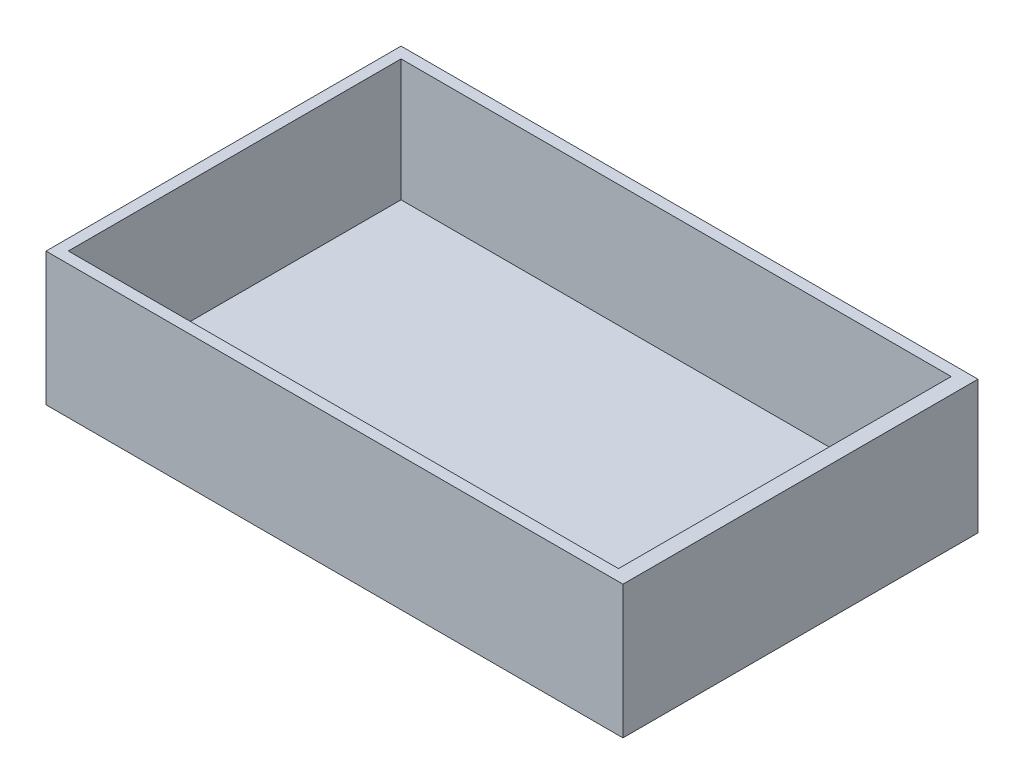
ISO-10303-21;
HEADER;
FILE_DESCRIPTION(('STEP AP214'),'2;1');
FILE_NAME('part.step','',(''),(''),'','','');
FILE_SCHEMA(('AUTOMOTIVE_DESIGN { 1 0 10303 214 1 1 1 1 }'));
ENDSEC;
DATA;
#1=APPLICATION_CONTEXT('core data for automotive mechanical design processes');
#2=APPLICATION_PROTOCOL_DEFINITION('international standard','automotive_design',2000,#1);
#3=PRODUCT_CONTEXT('',#1,'mechanical');
#4=PRODUCT('Part','Part','',(#3));
#5=PRODUCT_RELATED_PRODUCT_CATEGORY('part','',(#4));
#6=PRODUCT_DEFINITION_FORMATION('','',#4);
#7=PRODUCT_DEFINITION_CONTEXT('part definition',#1,'design');
#8=PRODUCT_DEFINITION('design','',#6,#7);
#9=PRODUCT_DEFINITION_SHAPE('','',#8);
#10=(LENGTH_UNIT() NAMED_UNIT(*) SI_UNIT(.MILLI.,.METRE.));
#11=(NAMED_UNIT(*) PLANE_ANGLE_UNIT() SI_UNIT($,.RADIAN.));
#12=(NAMED_UNIT(*) SI_UNIT($,.STERADIAN.) SOLID_ANGLE_UNIT());
#13=UNCERTAINTY_MEASURE_WITH_UNIT(LENGTH_MEASURE(1.E-05),#10,'distance_accuracy_value','');
#14=(GEOMETRIC_REPRESENTATION_CONTEXT(3) GLOBAL_UNCERTAINTY_ASSIGNED_CONTEXT((#13)) GLOBAL_UNIT_ASSIGNED_CONTEXT((#10,
#11,#12)) REPRESENTATION_CONTEXT('',''));
#15=CARTESIAN_POINT('',(0.,0.,0.));
#16=DIRECTION('',(0.,0.,1.));
#17=DIRECTION('',(1.,0.,0.));
#18=AXIS2_PLACEMENT_3D('',#15,#16,#17);
#19=CARTESIAN_POINT('',(0.,10.,0.));
#20=DIRECTION('',(1.,0.,0.));
#21=DIRECTION('',(0.,0.,-1.));
#22=AXIS2_PLACEMENT_3D('',#19,#20,#21);
#23=PLANE('',#22);
#24=DIRECTION('',(0.,0.,1.));
#25=VECTOR('',#24,1.);
#26=CARTESIAN_POINT('',(0.,0.,0.));
#27=LINE('',#26,#25);
#28=CARTESIAN_POINT('',(-1.11022302462516E-13,0.,-320.));
#29=VERTEX_POINT('',#28);
#30=CARTESIAN_POINT('',(0.,0.,0.));
#31=VERTEX_POINT('',#30);
#32=EDGE_CURVE('E149',#29,#31,#27,.T.);
#33=ORIENTED_EDGE('',*,*,#32,.T.);
#34=DIRECTION('',(0.,-1.,0.));
#35=VECTOR('',#34,1.);
#36=CARTESIAN_POINT('',(0.,10.,0.));
#37=LINE('',#36,#35);
#38=CARTESIAN_POINT('',(0.,120.,0.));
#39=VERTEX_POINT('',#38);
#40=EDGE_CURVE('E11',#39,#31,#37,.T.);
#41=ORIENTED_EDGE('',*,*,#40,.F.);
#42=DIRECTION('',(0.,0.,1.));
#43=VECTOR('',#42,1.);
#44=CARTESIAN_POINT('',(0.,120.,0.));
#45=LINE('',#44,#43);
#46=CARTESIAN_POINT('',(-1.11022302462516E-13,120.,-320.));
#47=VERTEX_POINT('',#46);
#48=EDGE_CURVE('E146',#47,#39,#45,.T.);
#49=ORIENTED_EDGE('',*,*,#48,.F.);
#50=DIRECTION('',(0.,-1.,0.));
#51=VECTOR('',#50,1.);
#52=CARTESIAN_POINT('',(-1.11022302462516E-13,10.,-320.));
#53=LINE('',#52,#51);
#54=EDGE_CURVE('E157',#47,#29,#53,.T.);
#55=ORIENTED_EDGE('',*,*,#54,.T.);
#56=EDGE_LOOP('',(#33,#41,#49,#55));
#57=FACE_BOUND('',#56,.T.);
#58=ADVANCED_FACE('F32',(#57),#23,.F.);
#59=CARTESIAN_POINT('',(0.,10.,0.));
#60=DIRECTION('',(0.,0.,-1.));
#61=DIRECTION('',(-1.,0.,0.));
#62=AXIS2_PLACEMENT_3D('',#59,#60,#61);
#63=PLANE('',#62);
#64=DIRECTION('',(1.,0.,0.));
#65=VECTOR('',#64,1.);
#66=CARTESIAN_POINT('',(0.,0.,0.));
#67=LINE('',#66,#65);
#68=CARTESIAN_POINT('',(520.,0.,0.));
#69=VERTEX_POINT('',#68);
#70=EDGE_CURVE('E152',#31,#69,#67,.T.);
#71=ORIENTED_EDGE('',*,*,#70,.T.);
#72=DIRECTION('',(0.,-1.,0.));
#73=VECTOR('',#72,1.);
#74=CARTESIAN_POINT('',(520.,10.,0.));
#75=LINE('',#74,#73);
#76=CARTESIAN_POINT('',(520.,120.,0.));
#77=VERTEX_POINT('',#76);
#78=EDGE_CURVE('E39',#77,#69,#75,.T.);
#79=ORIENTED_EDGE('',*,*,#78,.F.);
#80=DIRECTION('',(1.,0.,0.));
#81=VECTOR('',#80,1.);
#82=CARTESIAN_POINT('',(520.,120.,0.));
#83=LINE('',#82,#81);
#84=EDGE_CURVE('E114',#39,#77,#83,.T.);
#85=ORIENTED_EDGE('',*,*,#84,.F.);
#86=ORIENTED_EDGE('',*,*,#40,.T.);
#87=EDGE_LOOP('',(#71,#79,#85,#86));
#88=FACE_BOUND('',#87,.T.);
#89=ADVANCED_FACE('F175',(#88),#63,.F.);
#90=CARTESIAN_POINT('',(520.,10.,0.));
#91=DIRECTION('',(-1.,0.,0.));
#92=DIRECTION('',(0.,0.,1.));
#93=AXIS2_PLACEMENT_3D('',#90,#91,#92);
#94=PLANE('',#93);
#95=DIRECTION('',(0.,0.,-1.));
#96=VECTOR('',#95,1.);
#97=CARTESIAN_POINT('',(520.,0.,0.));
#98=LINE('',#97,#96);
#99=CARTESIAN_POINT('',(520.,0.,-320.));
#100=VERTEX_POINT('',#99);
#101=EDGE_CURVE('E154',#69,#100,#98,.T.);
#102=ORIENTED_EDGE('',*,*,#101,.T.);
#103=DIRECTION('',(0.,-1.,0.));
#104=VECTOR('',#103,1.);
#105=CARTESIAN_POINT('',(520.,10.,-320.));
#106=LINE('',#105,#104);
#107=CARTESIAN_POINT('',(520.,120.,-320.));
#108=VERTEX_POINT('',#107);
#109=EDGE_CURVE('E159',#108,#100,#106,.T.);
#110=ORIENTED_EDGE('',*,*,#109,.F.);
#111=DIRECTION('',(0.,0.,-1.));
#112=VECTOR('',#111,1.);
#113=CARTESIAN_POINT('',(520.,120.,-320.));
#114=LINE('',#113,#112);
#115=EDGE_CURVE('E140',#77,#108,#114,.T.);
#116=ORIENTED_EDGE('',*,*,#115,.F.);
#117=ORIENTED_EDGE('',*,*,#78,.T.);
#118=EDGE_LOOP('',(#102,#110,#116,#117));
#119=FACE_BOUND('',#118,.T.);
#120=ADVANCED_FACE('F164',(#119),#94,.F.);
#121=CARTESIAN_POINT('',(-1.11022302462516E-13,10.,-320.));
#122=DIRECTION('',(0.,0.,1.));
#123=DIRECTION('',(1.,0.,0.));
#124=AXIS2_PLACEMENT_3D('',#121,#122,#123);
#125=PLANE('',#124);
#126=DIRECTION('',(-1.,0.,0.));
#127=VECTOR('',#126,1.);
#128=CARTESIAN_POINT('',(-1.11022302462516E-13,0.,-320.));
#129=LINE('',#128,#127);
#130=EDGE_CURVE('E54',#100,#29,#129,.T.);
#131=ORIENTED_EDGE('',*,*,#130,.T.);
#132=ORIENTED_EDGE('',*,*,#54,.F.);
#133=DIRECTION('',(-1.,0.,0.));
#134=VECTOR('',#133,1.);
#135=CARTESIAN_POINT('',(-1.11022302462516E-13,120.,-320.));
#136=LINE('',#135,#134);
#137=EDGE_CURVE('E143',#108,#47,#136,.T.);
#138=ORIENTED_EDGE('',*,*,#137,.F.);
#139=ORIENTED_EDGE('',*,*,#109,.T.);
#140=EDGE_LOOP('',(#131,#132,#138,#139));
#141=FACE_BOUND('',#140,.T.);
#142=ADVANCED_FACE('F173',(#141),#125,.F.);
#143=CARTESIAN_POINT('',(0.,0.,0.));
#144=DIRECTION('',(0.,-1.,0.));
#145=DIRECTION('',(0.,0.,-1.));
#146=AXIS2_PLACEMENT_3D('',#143,#144,#145);
#147=PLANE('',#146);
#148=ORIENTED_EDGE('',*,*,#32,.F.);
#149=ORIENTED_EDGE('',*,*,#130,.F.);
#150=ORIENTED_EDGE('',*,*,#101,.F.);
#151=ORIENTED_EDGE('',*,*,#70,.F.);
#152=EDGE_LOOP('',(#148,#149,#150,#151));
#153=FACE_BOUND('',#152,.T.);
#154=ADVANCED_FACE('F169',(#153),#147,.T.);
#155=CARTESIAN_POINT('',(0.,120.,0.));
#156=DIRECTION('',(0.,-1.,0.));
#157=DIRECTION('',(0.,0.,-1.));
#158=AXIS2_PLACEMENT_3D('',#155,#156,#157);
#159=PLANE('',#158);
#160=ORIENTED_EDGE('',*,*,#84,.T.);
#161=ORIENTED_EDGE('',*,*,#115,.T.);
#162=ORIENTED_EDGE('',*,*,#137,.T.);
#163=ORIENTED_EDGE('',*,*,#48,.T.);
#164=EDGE_LOOP('',(#160,#161,#162,#163));
#165=FACE_BOUND('',#164,.T.);
#166=DIRECTION('',(0.,0.,1.));
#167=VECTOR('',#166,1.);
#168=CARTESIAN_POINT('',(10.,120.,-10.1318081877864));
#169=LINE('',#168,#167);
#170=CARTESIAN_POINT('',(10.,120.,-310.));
#171=VERTEX_POINT('',#170);
#172=CARTESIAN_POINT('',(10.,120.,-10.1318081877864));
#173=VERTEX_POINT('',#172);
#174=EDGE_CURVE('E98',#171,#173,#169,.T.);
#175=ORIENTED_EDGE('',*,*,#174,.F.);
#176=DIRECTION('',(-1.,0.,0.));
#177=VECTOR('',#176,1.);
#178=CARTESIAN_POINT('',(10.,120.,-310.));
#179=LINE('',#178,#177);
#180=CARTESIAN_POINT('',(505.843348951624,120.,-310.));
#181=VERTEX_POINT('',#180);
#182=EDGE_CURVE('E122',#181,#171,#179,.T.);
#183=ORIENTED_EDGE('',*,*,#182,.F.);
#184=DIRECTION('',(0.,0.,-1.));
#185=VECTOR('',#184,1.);
#186=CARTESIAN_POINT('',(505.843348951624,120.,-10.1318081877864));
#187=LINE('',#186,#185);
#188=CARTESIAN_POINT('',(505.843348951624,120.,-10.1318081877864));
#189=VERTEX_POINT('',#188);
#190=EDGE_CURVE('E120',#189,#181,#187,.T.);
#191=ORIENTED_EDGE('',*,*,#190,.F.);
#192=DIRECTION('',(1.,0.,0.));
#193=VECTOR('',#192,1.);
#194=CARTESIAN_POINT('',(10.,120.,-10.1318081877864));
#195=LINE('',#194,#193);
#196=EDGE_CURVE('E106',#173,#189,#195,.T.);
#197=ORIENTED_EDGE('',*,*,#196,.F.);
#198=EDGE_LOOP('',(#175,#183,#191,#197));
#199=FACE_BOUND('',#198,.T.);
#200=ADVANCED_FACE('F118',(#165,#199),#159,.F.);
#201=CARTESIAN_POINT('',(10.,120.,-10.1318081877864));
#202=DIRECTION('',(1.,0.,0.));
#203=DIRECTION('',(0.,0.,-1.));
#204=AXIS2_PLACEMENT_3D('',#201,#202,#203);
#205=PLANE('',#204);
#206=DIRECTION('',(0.,0.,1.));
#207=VECTOR('',#206,1.);
#208=CARTESIAN_POINT('',(10.,10.,-10.1318081877864));
#209=LINE('',#208,#207);
#210=CARTESIAN_POINT('',(10.,10.,-310.));
#211=VERTEX_POINT('',#210);
#212=CARTESIAN_POINT('',(10.,10.,-10.1318081877864));
#213=VERTEX_POINT('',#212);
#214=EDGE_CURVE('E126',#211,#213,#209,.T.);
#215=ORIENTED_EDGE('',*,*,#214,.F.);
#216=DIRECTION('',(0.,-1.,0.));
#217=VECTOR('',#216,1.);
#218=CARTESIAN_POINT('',(10.,120.,-310.));
#219=LINE('',#218,#217);
#220=EDGE_CURVE('E46',#171,#211,#219,.T.);
#221=ORIENTED_EDGE('',*,*,#220,.F.);
#222=ORIENTED_EDGE('',*,*,#174,.T.);
#223=DIRECTION('',(0.,-1.,0.));
#224=VECTOR('',#223,1.);
#225=CARTESIAN_POINT('',(10.,120.,-10.1318081877864));
#226=LINE('',#225,#224);
#227=EDGE_CURVE('E101',#173,#213,#226,.T.);
#228=ORIENTED_EDGE('',*,*,#227,.T.);
#229=EDGE_LOOP('',(#215,#221,#222,#228));
#230=FACE_BOUND('',#229,.T.);
#231=ADVANCED_FACE('F100',(#230),#205,.T.);
#232=CARTESIAN_POINT('',(10.,120.,-10.1318081877864));
#233=DIRECTION('',(0.,0.,-1.));
#234=DIRECTION('',(-1.,0.,0.));
#235=AXIS2_PLACEMENT_3D('',#232,#233,#234);
#236=PLANE('',#235);
#237=DIRECTION('',(1.,0.,0.));
#238=VECTOR('',#237,1.);
#239=CARTESIAN_POINT('',(10.,10.,-10.1318081877864));
#240=LINE('',#239,#238);
#241=CARTESIAN_POINT('',(505.843348951624,10.,-10.1318081877864));
#242=VERTEX_POINT('',#241);
#243=EDGE_CURVE('E113',#213,#242,#240,.T.);
#244=ORIENTED_EDGE('',*,*,#243,.F.);
#245=ORIENTED_EDGE('',*,*,#227,.F.);
#246=ORIENTED_EDGE('',*,*,#196,.T.);
#247=DIRECTION('',(0.,-1.,0.));
#248=VECTOR('',#247,1.);
#249=CARTESIAN_POINT('',(505.843348951624,120.,-10.1318081877864));
#250=LINE('',#249,#248);
#251=EDGE_CURVE('E115',#189,#242,#250,.T.);
#252=ORIENTED_EDGE('',*,*,#251,.T.);
#253=EDGE_LOOP('',(#244,#245,#246,#252));
#254=FACE_BOUND('',#253,.T.);
#255=ADVANCED_FACE('F110',(#254),#236,.T.);
#256=CARTESIAN_POINT('',(505.843348951624,120.,-10.1318081877864));
#257=DIRECTION('',(-1.,0.,0.));
#258=DIRECTION('',(0.,0.,1.));
#259=AXIS2_PLACEMENT_3D('',#256,#257,#258);
#260=PLANE('',#259);
#261=DIRECTION('',(0.,0.,-1.));
#262=VECTOR('',#261,1.);
#263=CARTESIAN_POINT('',(505.843348951624,10.,-10.1318081877864));
#264=LINE('',#263,#262);
#265=CARTESIAN_POINT('',(505.843348951624,10.,-310.));
#266=VERTEX_POINT('',#265);
#267=EDGE_CURVE('E129',#242,#266,#264,.T.);
#268=ORIENTED_EDGE('',*,*,#267,.F.);
#269=ORIENTED_EDGE('',*,*,#251,.F.);
#270=ORIENTED_EDGE('',*,*,#190,.T.);
#271=DIRECTION('',(0.,-1.,0.));
#272=VECTOR('',#271,1.);
#273=CARTESIAN_POINT('',(505.843348951624,120.,-310.));
#274=LINE('',#273,#272);
#275=EDGE_CURVE('E135',#181,#266,#274,.T.);
#276=ORIENTED_EDGE('',*,*,#275,.T.);
#277=EDGE_LOOP('',(#268,#269,#270,#276));
#278=FACE_BOUND('',#277,.T.);
#279=ADVANCED_FACE('F198',(#278),#260,.T.);
#280=CARTESIAN_POINT('',(10.,120.,-310.));
#281=DIRECTION('',(0.,0.,1.));
#282=DIRECTION('',(1.,0.,0.));
#283=AXIS2_PLACEMENT_3D('',#280,#281,#282);
#284=PLANE('',#283);
#285=DIRECTION('',(-1.,0.,0.));
#286=VECTOR('',#285,1.);
#287=CARTESIAN_POINT('',(10.,10.,-310.));
#288=LINE('',#287,#286);
#289=EDGE_CURVE('E107',#266,#211,#288,.T.);
#290=ORIENTED_EDGE('',*,*,#289,.F.);
#291=ORIENTED_EDGE('',*,*,#275,.F.);
#292=ORIENTED_EDGE('',*,*,#182,.T.);
#293=ORIENTED_EDGE('',*,*,#220,.T.);
#294=EDGE_LOOP('',(#290,#291,#292,#293));
#295=FACE_BOUND('',#294,.T.);
#296=ADVANCED_FACE('F190',(#295),#284,.T.);
#297=CARTESIAN_POINT('',(0.,10.,0.));
#298=DIRECTION('',(0.,-1.,0.));
#299=DIRECTION('',(0.,0.,-1.));
#300=AXIS2_PLACEMENT_3D('',#297,#298,#299);
#301=PLANE('',#300);
#302=ORIENTED_EDGE('',*,*,#289,.T.);
#303=ORIENTED_EDGE('',*,*,#214,.T.);
#304=ORIENTED_EDGE('',*,*,#243,.T.);
#305=ORIENTED_EDGE('',*,*,#267,.T.);
#306=EDGE_LOOP('',(#302,#303,#304,#305));
#307=FACE_BOUND('',#306,.T.);
#308=ADVANCED_FACE('F187',(#307),#301,.F.);
#309=CLOSED_SHELL('',(#58,#89,#120,#142,#154,#200,#231,#255,#279,#296,#308));
#310=MANIFOLD_SOLID_BREP('B2',#309);
#311=ADVANCED_BREP_SHAPE_REPRESENTATION('',(#18,#310),#14);
#312=SHAPE_DEFINITION_REPRESENTATION(#9,#311);
ENDSEC;
END-ISO-10303-21;
